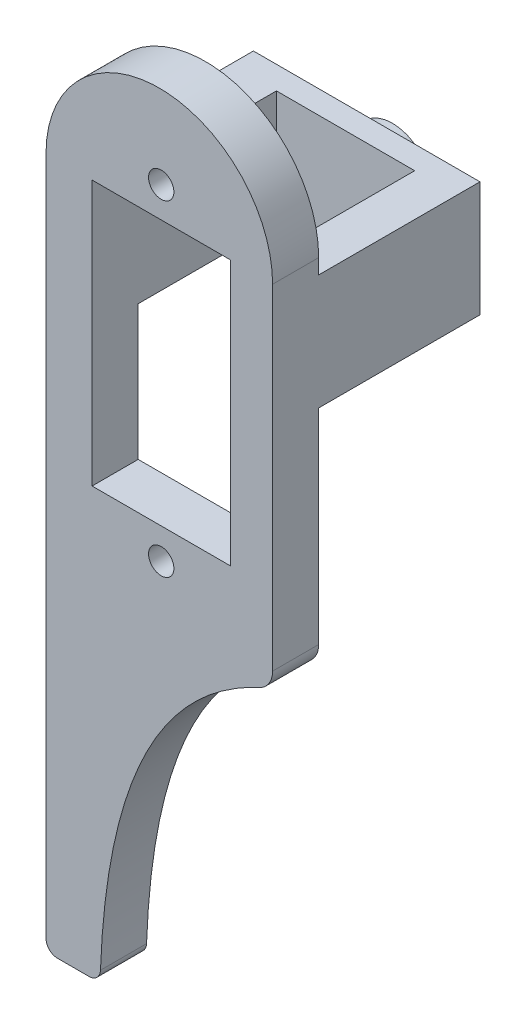
ISO-10303-21;
HEADER;
FILE_DESCRIPTION(('STEP AP214'),'2;1');
FILE_NAME('part.step','',(''),(''),'','','');
FILE_SCHEMA(('AUTOMOTIVE_DESIGN { 1 0 10303 214 1 1 1 1 }'));
ENDSEC;
DATA;
#1=APPLICATION_CONTEXT('core data for automotive mechanical design processes');
#2=APPLICATION_PROTOCOL_DEFINITION('international standard','automotive_design',2000,#1);
#3=PRODUCT_CONTEXT('',#1,'mechanical');
#4=PRODUCT('Part','Part','',(#3));
#5=PRODUCT_RELATED_PRODUCT_CATEGORY('part','',(#4));
#6=PRODUCT_DEFINITION_FORMATION('','',#4);
#7=PRODUCT_DEFINITION_CONTEXT('part definition',#1,'design');
#8=PRODUCT_DEFINITION('design','',#6,#7);
#9=PRODUCT_DEFINITION_SHAPE('','',#8);
#10=(LENGTH_UNIT() NAMED_UNIT(*) SI_UNIT(.MILLI.,.METRE.));
#11=(NAMED_UNIT(*) PLANE_ANGLE_UNIT() SI_UNIT($,.RADIAN.));
#12=(NAMED_UNIT(*) SI_UNIT($,.STERADIAN.) SOLID_ANGLE_UNIT());
#13=UNCERTAINTY_MEASURE_WITH_UNIT(LENGTH_MEASURE(1.E-05),#10,'distance_accuracy_value','');
#14=(GEOMETRIC_REPRESENTATION_CONTEXT(3) GLOBAL_UNCERTAINTY_ASSIGNED_CONTEXT((#13)) GLOBAL_UNIT_ASSIGNED_CONTEXT((#10,
#11,#12)) REPRESENTATION_CONTEXT('',''));
#15=CARTESIAN_POINT('',(0.,0.,0.));
#16=DIRECTION('',(0.,0.,1.));
#17=DIRECTION('',(1.,0.,0.));
#18=AXIS2_PLACEMENT_3D('',#15,#16,#17);
#19=CARTESIAN_POINT('',(20.0527361312337,1.43470935286026,0.));
#20=DIRECTION('',(0.,0.,-1.));
#21=DIRECTION('',(-1.,0.,0.));
#22=AXIS2_PLACEMENT_3D('',#19,#20,#21);
#23=PLANE('',#22);
#24=CARTESIAN_POINT('',(20.2195760836481,-24.2152906471397,0.));
#25=DIRECTION('',(0.,0.,-1.));
#26=DIRECTION('',(-1.,0.,0.));
#27=AXIS2_PLACEMENT_3D('',#24,#25,#26);
#28=CIRCLE('',#27,1.1);
#29=CARTESIAN_POINT('',(19.1195760836481,-24.2152906471397,0.));
#30=VERTEX_POINT('',#29);
#31=EDGE_CURVE('E193',#30,#30,#28,.F.);
#32=ORIENTED_EDGE('',*,*,#31,.T.);
#33=EDGE_LOOP('',(#32));
#34=FACE_BOUND('',#33,.T.);
#35=DIRECTION('',(0.,-1.,0.));
#36=VECTOR('',#35,1.);
#37=CARTESIAN_POINT('',(10.2195760836481,1.43470935286026,0.));
#38=LINE('',#37,#36);
#39=CARTESIAN_POINT('',(10.2195760836481,-9.86529064713974,0.));
#40=VERTEX_POINT('',#39);
#41=CARTESIAN_POINT('',(10.2195760836481,-57.5652906471397,0.));
#42=VERTEX_POINT('',#41);
#43=EDGE_CURVE('E56',#40,#42,#38,.T.);
#44=ORIENTED_EDGE('',*,*,#43,.F.);
#45=DIRECTION('',(-1.,0.,0.));
#46=VECTOR('',#45,1.);
#47=CARTESIAN_POINT('',(14.2195760836481,-9.86529064713974,0.));
#48=LINE('',#47,#46);
#49=CARTESIAN_POINT('',(14.2195760836481,-9.86529064713974,0.));
#50=VERTEX_POINT('',#49);
#51=EDGE_CURVE('E224',#50,#40,#48,.T.);
#52=ORIENTED_EDGE('',*,*,#51,.F.);
#53=DIRECTION('',(0.,-1.,0.));
#54=VECTOR('',#53,1.);
#55=CARTESIAN_POINT('',(14.2195760836481,1.43470935286026,0.));
#56=LINE('',#55,#54);
#57=CARTESIAN_POINT('',(14.2195760836481,-21.5652906471397,0.));
#58=VERTEX_POINT('',#57);
#59=EDGE_CURVE('E295',#50,#58,#56,.T.);
#60=ORIENTED_EDGE('',*,*,#59,.T.);
#61=DIRECTION('',(1.,0.,0.));
#62=VECTOR('',#61,1.);
#63=CARTESIAN_POINT('',(14.2195760836481,-21.5652906471397,0.));
#64=LINE('',#63,#62);
#65=CARTESIAN_POINT('',(26.2195760836481,-21.5652906471397,0.));
#66=VERTEX_POINT('',#65);
#67=EDGE_CURVE('E318',#58,#66,#64,.T.);
#68=ORIENTED_EDGE('',*,*,#67,.T.);
#69=DIRECTION('',(0.,1.,0.));
#70=VECTOR('',#69,1.);
#71=CARTESIAN_POINT('',(26.2195760836481,1.43470935286026,0.));
#72=LINE('',#71,#70);
#73=CARTESIAN_POINT('',(26.2195760836481,-9.86529064713974,0.));
#74=VERTEX_POINT('',#73);
#75=EDGE_CURVE('E288',#66,#74,#72,.T.);
#76=ORIENTED_EDGE('',*,*,#75,.T.);
#77=DIRECTION('',(-1.,0.,0.));
#78=VECTOR('',#77,1.);
#79=CARTESIAN_POINT('',(29.8858961788194,-9.86529064713974,0.));
#80=LINE('',#79,#78);
#81=CARTESIAN_POINT('',(29.8858961788194,-9.86529064713974,0.));
#82=VERTEX_POINT('',#81);
#83=EDGE_CURVE('E251',#82,#74,#80,.T.);
#84=ORIENTED_EDGE('',*,*,#83,.F.);
#85=DIRECTION('',(0.,1.,0.));
#86=VECTOR('',#85,1.);
#87=CARTESIAN_POINT('',(29.8858961788194,-28.969975988386,0.));
#88=LINE('',#87,#86);
#89=CARTESIAN_POINT('',(29.8858961788194,-27.6467575510426,0.));
#90=VERTEX_POINT('',#89);
#91=EDGE_CURVE('E189',#90,#82,#88,.T.);
#92=ORIENTED_EDGE('',*,*,#91,.F.);
#93=CARTESIAN_POINT('',(27.8858961788193,-27.6467575510426,0.));
#94=DIRECTION('',(0.,0.,-1.));
#95=DIRECTION('',(-1.,0.,0.));
#96=AXIS2_PLACEMENT_3D('',#93,#94,#95);
#97=CIRCLE('',#96,2.);
#98=CARTESIAN_POINT('',(28.7223689960516,-29.4634339740832,0.));
#99=VERTEX_POINT('',#98);
#100=EDGE_CURVE('E657',#90,#99,#97,.T.);
#101=ORIENTED_EDGE('',*,*,#100,.T.);
#102=CARTESIAN_POINT('',(14.9212994340402,-58.3072050953959,0.));
#103=CARTESIAN_POINT('',(15.603913992348,-34.5286239738719,0.));
#104=CARTESIAN_POINT('',(29.8858961788194,-28.969975988386,0.));
#105=B_SPLINE_CURVE_WITH_KNOTS('',2,(#102,#103,#104),.UNSPECIFIED.,.F.,.F.,(3,3),(0.,1.),.UNSPECIFIED.);
#106=CARTESIAN_POINT('',(14.9446503491445,-57.6029191019327,0.));
#107=VERTEX_POINT('',#106);
#108=EDGE_CURVE('E627',#107,#99,#105,.T.);
#109=ORIENTED_EDGE('',*,*,#108,.F.);
#110=CARTESIAN_POINT('',(13.9453585502239,-57.5652906471397,0.));
#111=DIRECTION('',(0.,0.,-1.));
#112=DIRECTION('',(-1.,0.,0.));
#113=AXIS2_PLACEMENT_3D('',#110,#111,#112);
#114=CIRCLE('',#113,1.);
#115=CARTESIAN_POINT('',(13.9453585502239,-58.5652906471397,0.));
#116=VERTEX_POINT('',#115);
#117=EDGE_CURVE('E672',#107,#116,#114,.T.);
#118=ORIENTED_EDGE('',*,*,#117,.T.);
#119=DIRECTION('',(1.,0.,0.));
#120=VECTOR('',#119,1.);
#121=CARTESIAN_POINT('',(10.2195760836481,-58.5652906471397,0.));
#122=LINE('',#121,#120);
#123=CARTESIAN_POINT('',(11.2195760836481,-58.5652906471397,0.));
#124=VERTEX_POINT('',#123);
#125=EDGE_CURVE('E641',#124,#116,#122,.T.);
#126=ORIENTED_EDGE('',*,*,#125,.F.);
#127=CARTESIAN_POINT('',(11.2195760836481,-57.5652906471397,0.));
#128=DIRECTION('',(0.,0.,-1.));
#129=DIRECTION('',(-1.,0.,0.));
#130=AXIS2_PLACEMENT_3D('',#127,#128,#129);
#131=CIRCLE('',#130,1.);
#132=EDGE_CURVE('E687',#124,#42,#131,.T.);
#133=ORIENTED_EDGE('',*,*,#132,.T.);
#134=EDGE_LOOP('',(#44,#52,#60,#68,#76,#84,#92,#101,#109,#118,#126,#133));
#135=FACE_BOUND('',#134,.T.);
#136=ADVANCED_FACE('F39',(#34,#135),#23,.T.);
#137=CARTESIAN_POINT('',(20.2195760836481,4.08470935286026,0.));
#138=DIRECTION('',(0.,0.,-1.));
#139=DIRECTION('',(-1.,0.,0.));
#140=AXIS2_PLACEMENT_3D('',#137,#138,#139);
#141=CIRCLE('',#140,1.1);
#142=CARTESIAN_POINT('',(19.1195760836481,4.08470935286026,0.));
#143=VERTEX_POINT('',#142);
#144=EDGE_CURVE('E277',#143,#143,#141,.F.);
#145=ORIENTED_EDGE('',*,*,#144,.T.);
#146=EDGE_LOOP('',(#145));
#147=FACE_BOUND('',#146,.T.);
#148=CARTESIAN_POINT('',(14.2195760836481,1.43470935286026,0.));
#149=VERTEX_POINT('',#148);
#150=CARTESIAN_POINT('',(14.2195760836481,0.134709352860258,0.));
#151=VERTEX_POINT('',#150);
#152=EDGE_CURVE('E296',#149,#151,#56,.T.);
#153=ORIENTED_EDGE('',*,*,#152,.T.);
#154=DIRECTION('',(1.,0.,0.));
#155=VECTOR('',#154,1.);
#156=CARTESIAN_POINT('',(14.2195760836481,0.134709352860258,0.));
#157=LINE('',#156,#155);
#158=CARTESIAN_POINT('',(10.2195760836481,0.134709352860258,0.));
#159=VERTEX_POINT('',#158);
#160=EDGE_CURVE('E64',#159,#151,#157,.T.);
#161=ORIENTED_EDGE('',*,*,#160,.F.);
#162=CARTESIAN_POINT('',(10.2195760836481,1.43470935286026,0.));
#163=VERTEX_POINT('',#162);
#164=EDGE_CURVE('E634',#163,#159,#38,.T.);
#165=ORIENTED_EDGE('',*,*,#164,.F.);
#166=CARTESIAN_POINT('',(20.0527361312337,1.43470935286026,0.));
#167=DIRECTION('',(0.,0.,1.));
#168=DIRECTION('',(-1.,0.,0.));
#169=AXIS2_PLACEMENT_3D('',#166,#167,#168);
#170=CIRCLE('',#169,9.83316004758562);
#171=CARTESIAN_POINT('',(29.8858961788194,1.43470935286026,0.));
#172=VERTEX_POINT('',#171);
#173=EDGE_CURVE('E331',#172,#163,#170,.T.);
#174=ORIENTED_EDGE('',*,*,#173,.F.);
#175=CARTESIAN_POINT('',(29.8858961788194,0.134709352860259,0.));
#176=VERTEX_POINT('',#175);
#177=EDGE_CURVE('E621',#176,#172,#88,.T.);
#178=ORIENTED_EDGE('',*,*,#177,.F.);
#179=DIRECTION('',(1.,0.,0.));
#180=VECTOR('',#179,1.);
#181=CARTESIAN_POINT('',(29.8858961788194,0.134709352860259,0.));
#182=LINE('',#181,#180);
#183=CARTESIAN_POINT('',(26.2195760836481,0.134709352860258,0.));
#184=VERTEX_POINT('',#183);
#185=EDGE_CURVE('E257',#184,#176,#182,.T.);
#186=ORIENTED_EDGE('',*,*,#185,.F.);
#187=CARTESIAN_POINT('',(26.2195760836481,1.43470935286026,0.));
#188=VERTEX_POINT('',#187);
#189=EDGE_CURVE('E276',#184,#188,#72,.T.);
#190=ORIENTED_EDGE('',*,*,#189,.T.);
#191=DIRECTION('',(-1.,0.,0.));
#192=VECTOR('',#191,1.);
#193=CARTESIAN_POINT('',(14.2195760836481,1.43470935286026,0.));
#194=LINE('',#193,#192);
#195=EDGE_CURVE('E291',#188,#149,#194,.T.);
#196=ORIENTED_EDGE('',*,*,#195,.T.);
#197=EDGE_LOOP('',(#153,#161,#165,#174,#178,#186,#190,#196));
#198=FACE_BOUND('',#197,.T.);
#199=ADVANCED_FACE('F372',(#147,#198),#23,.T.);
#200=CARTESIAN_POINT('',(20.0527361312337,1.43470935286026,4.));
#201=DIRECTION('',(0.,0.,-1.));
#202=DIRECTION('',(-1.,0.,0.));
#203=AXIS2_PLACEMENT_3D('',#200,#201,#202);
#204=CYLINDRICAL_SURFACE('',#203,9.83316004758562);
#205=ORIENTED_EDGE('',*,*,#173,.T.);
#206=DIRECTION('',(0.,0.,-1.));
#207=VECTOR('',#206,1.);
#208=CARTESIAN_POINT('',(10.2195760836481,1.43470935286026,4.));
#209=LINE('',#208,#207);
#210=CARTESIAN_POINT('',(10.2195760836481,1.43470935286026,4.));
#211=VERTEX_POINT('',#210);
#212=EDGE_CURVE('E632',#211,#163,#209,.T.);
#213=ORIENTED_EDGE('',*,*,#212,.F.);
#214=CARTESIAN_POINT('',(20.0527361312337,1.43470935286026,4.));
#215=DIRECTION('',(0.,0.,1.));
#216=DIRECTION('',(-1.,0.,0.));
#217=AXIS2_PLACEMENT_3D('',#214,#215,#216);
#218=CIRCLE('',#217,9.83316004758562);
#219=CARTESIAN_POINT('',(29.8858961788194,1.43470935286026,4.));
#220=VERTEX_POINT('',#219);
#221=EDGE_CURVE('E332',#220,#211,#218,.T.);
#222=ORIENTED_EDGE('',*,*,#221,.F.);
#223=DIRECTION('',(0.,0.,-1.));
#224=VECTOR('',#223,1.);
#225=CARTESIAN_POINT('',(29.8858961788194,1.43470935286026,4.));
#226=LINE('',#225,#224);
#227=EDGE_CURVE('E623',#220,#172,#226,.T.);
#228=ORIENTED_EDGE('',*,*,#227,.T.);
#229=EDGE_LOOP('',(#205,#213,#222,#228));
#230=FACE_BOUND('',#229,.T.);
#231=ADVANCED_FACE('F368',(#230),#204,.T.);
#232=CARTESIAN_POINT('',(10.2195760836481,1.43470935286026,4.));
#233=DIRECTION('',(1.,0.,0.));
#234=DIRECTION('',(0.,0.,-1.));
#235=AXIS2_PLACEMENT_3D('',#232,#233,#234);
#236=PLANE('',#235);
#237=ORIENTED_EDGE('',*,*,#164,.T.);
#238=DIRECTION('',(0.,0.,1.));
#239=VECTOR('',#238,1.);
#240=CARTESIAN_POINT('',(10.2195760836481,0.134709352860258,-12.));
#241=LINE('',#240,#239);
#242=CARTESIAN_POINT('',(10.2195760836481,0.134709352860259,-14.));
#243=VERTEX_POINT('',#242);
#244=EDGE_CURVE('E241',#243,#159,#241,.T.);
#245=ORIENTED_EDGE('',*,*,#244,.F.);
#246=DIRECTION('',(0.,1.,0.));
#247=VECTOR('',#246,1.);
#248=CARTESIAN_POINT('',(10.2195760836481,0.134709352860259,-14.));
#249=LINE('',#248,#247);
#250=CARTESIAN_POINT('',(10.2195760836481,-9.86529064713974,-14.));
#251=VERTEX_POINT('',#250);
#252=EDGE_CURVE('E205',#251,#243,#249,.T.);
#253=ORIENTED_EDGE('',*,*,#252,.F.);
#254=DIRECTION('',(0.,0.,1.));
#255=VECTOR('',#254,1.);
#256=CARTESIAN_POINT('',(10.2195760836481,-9.86529064713974,-12.));
#257=LINE('',#256,#255);
#258=EDGE_CURVE('E200',#251,#40,#257,.T.);
#259=ORIENTED_EDGE('',*,*,#258,.T.);
#260=ORIENTED_EDGE('',*,*,#43,.T.);
#261=DIRECTION('',(0.,0.,-1.));
#262=VECTOR('',#261,1.);
#263=CARTESIAN_POINT('',(10.2195760836481,-57.5652906471397,4.));
#264=LINE('',#263,#262);
#265=CARTESIAN_POINT('',(10.2195760836481,-57.5652906471397,4.));
#266=VERTEX_POINT('',#265);
#267=EDGE_CURVE('E689',#42,#266,#264,.F.);
#268=ORIENTED_EDGE('',*,*,#267,.T.);
#269=DIRECTION('',(0.,-1.,0.));
#270=VECTOR('',#269,1.);
#271=CARTESIAN_POINT('',(10.2195760836481,1.43470935286026,4.));
#272=LINE('',#271,#270);
#273=EDGE_CURVE('E336',#211,#266,#272,.T.);
#274=ORIENTED_EDGE('',*,*,#273,.F.);
#275=ORIENTED_EDGE('',*,*,#212,.T.);
#276=EDGE_LOOP('',(#237,#245,#253,#259,#260,#268,#274,#275));
#277=FACE_BOUND('',#276,.T.);
#278=ADVANCED_FACE('F364',(#277),#236,.F.);
#279=CARTESIAN_POINT('',(10.2195760836481,-58.5652906471397,4.));
#280=DIRECTION('',(0.,1.,0.));
#281=DIRECTION('',(0.,0.,1.));
#282=AXIS2_PLACEMENT_3D('',#279,#280,#281);
#283=PLANE('',#282);
#284=DIRECTION('',(1.,0.,0.));
#285=VECTOR('',#284,1.);
#286=CARTESIAN_POINT('',(10.2195760836481,-58.5652906471397,4.));
#287=LINE('',#286,#285);
#288=CARTESIAN_POINT('',(11.2195760836481,-58.5652906471397,4.));
#289=VERTEX_POINT('',#288);
#290=CARTESIAN_POINT('',(13.9453585502239,-58.5652906471397,4.));
#291=VERTEX_POINT('',#290);
#292=EDGE_CURVE('E340',#289,#291,#287,.T.);
#293=ORIENTED_EDGE('',*,*,#292,.F.);
#294=DIRECTION('',(0.,0.,-1.));
#295=VECTOR('',#294,1.);
#296=CARTESIAN_POINT('',(11.2195760836481,-58.5652906471397,4.));
#297=LINE('',#296,#295);
#298=EDGE_CURVE('E683',#289,#124,#297,.T.);
#299=ORIENTED_EDGE('',*,*,#298,.T.);
#300=ORIENTED_EDGE('',*,*,#125,.T.);
#301=DIRECTION('',(0.,0.,-1.));
#302=VECTOR('',#301,1.);
#303=CARTESIAN_POINT('',(13.9453585502239,-58.5652906471397,4.));
#304=LINE('',#303,#302);
#305=EDGE_CURVE('E676',#116,#291,#304,.F.);
#306=ORIENTED_EDGE('',*,*,#305,.T.);
#307=EDGE_LOOP('',(#293,#299,#300,#306));
#308=FACE_BOUND('',#307,.T.);
#309=ADVANCED_FACE('F359',(#308),#283,.F.);
#310=CARTESIAN_POINT('',(14.9212994340402,-58.3072050953959,4.));
#311=CARTESIAN_POINT('',(15.603913992348,-34.5286239738719,4.));
#312=CARTESIAN_POINT('',(29.8858961788194,-28.969975988386,4.));
#313=B_SPLINE_CURVE_WITH_KNOTS('',2,(#310,#311,#312),.UNSPECIFIED.,.F.,.F.,(3,3),(0.,1.),.UNSPECIFIED.);
#314=DIRECTION('',(0.,0.,-1.));
#315=VECTOR('',#314,1.);
#316=SURFACE_OF_LINEAR_EXTRUSION('',#313,#315);
#317=CARTESIAN_POINT('',(14.9446503491445,-57.6029191019327,4.));
#318=VERTEX_POINT('',#317);
#319=CARTESIAN_POINT('',(28.7223689960516,-29.4634339740832,4.));
#320=VERTEX_POINT('',#319);
#321=EDGE_CURVE('E343',#318,#320,#313,.T.);
#322=ORIENTED_EDGE('',*,*,#321,.F.);
#323=DIRECTION('',(0.,0.,-1.));
#324=VECTOR('',#323,1.);
#325=CARTESIAN_POINT('',(14.9446503491445,-57.6029191019324,4.));
#326=LINE('',#325,#324);
#327=EDGE_CURVE('E668',#318,#107,#326,.T.);
#328=ORIENTED_EDGE('',*,*,#327,.T.);
#329=ORIENTED_EDGE('',*,*,#108,.T.);
#330=DIRECTION('',(0.,0.,-1.));
#331=VECTOR('',#330,1.);
#332=CARTESIAN_POINT('',(28.7223689960495,-29.4634339740842,0.));
#333=LINE('',#332,#331);
#334=EDGE_CURVE('E661',#99,#320,#333,.F.);
#335=ORIENTED_EDGE('',*,*,#334,.T.);
#336=EDGE_LOOP('',(#322,#328,#329,#335));
#337=FACE_BOUND('',#336,.T.);
#338=ADVANCED_FACE('F355',(#337),#316,.F.);
#339=CARTESIAN_POINT('',(29.8858961788194,-28.969975988386,4.));
#340=DIRECTION('',(-1.,0.,0.));
#341=DIRECTION('',(0.,0.,1.));
#342=AXIS2_PLACEMENT_3D('',#339,#340,#341);
#343=PLANE('',#342);
#344=DIRECTION('',(0.,1.,0.));
#345=VECTOR('',#344,1.);
#346=CARTESIAN_POINT('',(29.8858961788194,-28.969975988386,4.));
#347=LINE('',#346,#345);
#348=CARTESIAN_POINT('',(29.8858961788194,-27.6467575510426,4.));
#349=VERTEX_POINT('',#348);
#350=EDGE_CURVE('E349',#349,#220,#347,.T.);
#351=ORIENTED_EDGE('',*,*,#350,.F.);
#352=DIRECTION('',(0.,0.,-1.));
#353=VECTOR('',#352,1.);
#354=CARTESIAN_POINT('',(29.8858961788194,-27.6467575510426,4.));
#355=LINE('',#354,#353);
#356=EDGE_CURVE('E654',#349,#90,#355,.T.);
#357=ORIENTED_EDGE('',*,*,#356,.T.);
#358=ORIENTED_EDGE('',*,*,#91,.T.);
#359=DIRECTION('',(0.,0.,1.));
#360=VECTOR('',#359,1.);
#361=CARTESIAN_POINT('',(29.8858961788194,-9.86529064713974,-12.));
#362=LINE('',#361,#360);
#363=CARTESIAN_POINT('',(29.8858961788194,-9.86529064713974,-14.));
#364=VERTEX_POINT('',#363);
#365=EDGE_CURVE('E180',#364,#82,#362,.T.);
#366=ORIENTED_EDGE('',*,*,#365,.F.);
#367=DIRECTION('',(0.,-1.,0.));
#368=VECTOR('',#367,1.);
#369=CARTESIAN_POINT('',(29.8858961788194,0.134709352860259,-14.));
#370=LINE('',#369,#368);
#371=CARTESIAN_POINT('',(29.8858961788194,0.134709352860259,-14.));
#372=VERTEX_POINT('',#371);
#373=EDGE_CURVE('E186',#372,#364,#370,.T.);
#374=ORIENTED_EDGE('',*,*,#373,.F.);
#375=DIRECTION('',(0.,0.,1.));
#376=VECTOR('',#375,1.);
#377=CARTESIAN_POINT('',(29.8858961788194,0.134709352860259,-12.));
#378=LINE('',#377,#376);
#379=EDGE_CURVE('E256',#372,#176,#378,.T.);
#380=ORIENTED_EDGE('',*,*,#379,.T.);
#381=ORIENTED_EDGE('',*,*,#177,.T.);
#382=ORIENTED_EDGE('',*,*,#227,.F.);
#383=EDGE_LOOP('',(#351,#357,#358,#366,#374,#380,#381,#382));
#384=FACE_BOUND('',#383,.T.);
#385=ADVANCED_FACE('F183',(#384),#343,.F.);
#386=CARTESIAN_POINT('',(20.0527361312337,1.43470935286026,4.));
#387=DIRECTION('',(0.,0.,-1.));
#388=DIRECTION('',(-1.,0.,0.));
#389=AXIS2_PLACEMENT_3D('',#386,#387,#388);
#390=PLANE('',#389);
#391=CARTESIAN_POINT('',(20.2195760836481,-24.2152906471397,4.));
#392=DIRECTION('',(0.,0.,1.));
#393=DIRECTION('',(1.,0.,0.));
#394=AXIS2_PLACEMENT_3D('',#391,#392,#393);
#395=CIRCLE('',#394,1.1);
#396=CARTESIAN_POINT('',(21.3195760836481,-24.2152906471397,4.));
#397=VERTEX_POINT('',#396);
#398=EDGE_CURVE('E281',#397,#397,#395,.T.);
#399=ORIENTED_EDGE('',*,*,#398,.F.);
#400=EDGE_LOOP('',(#399));
#401=FACE_BOUND('',#400,.T.);
#402=CARTESIAN_POINT('',(20.2195760836481,4.08470935286026,4.));
#403=DIRECTION('',(0.,0.,1.));
#404=DIRECTION('',(1.,0.,0.));
#405=AXIS2_PLACEMENT_3D('',#402,#403,#404);
#406=CIRCLE('',#405,1.1);
#407=CARTESIAN_POINT('',(21.3195760836481,4.08470935286026,4.));
#408=VERTEX_POINT('',#407);
#409=EDGE_CURVE('E272',#408,#408,#406,.T.);
#410=ORIENTED_EDGE('',*,*,#409,.F.);
#411=EDGE_LOOP('',(#410));
#412=FACE_BOUND('',#411,.T.);
#413=DIRECTION('',(1.,0.,0.));
#414=VECTOR('',#413,1.);
#415=CARTESIAN_POINT('',(14.2195760836481,-21.5652906471397,4.));
#416=LINE('',#415,#414);
#417=CARTESIAN_POINT('',(14.2195760836481,-21.5652906471397,4.));
#418=VERTEX_POINT('',#417);
#419=CARTESIAN_POINT('',(26.2195760836481,-21.5652906471397,4.));
#420=VERTEX_POINT('',#419);
#421=EDGE_CURVE('E302',#418,#420,#416,.T.);
#422=ORIENTED_EDGE('',*,*,#421,.F.);
#423=DIRECTION('',(0.,-1.,0.));
#424=VECTOR('',#423,1.);
#425=CARTESIAN_POINT('',(14.2195760836481,1.43470935286026,4.));
#426=LINE('',#425,#424);
#427=CARTESIAN_POINT('',(14.2195760836481,1.43470935286026,4.));
#428=VERTEX_POINT('',#427);
#429=EDGE_CURVE('E299',#428,#418,#426,.T.);
#430=ORIENTED_EDGE('',*,*,#429,.F.);
#431=DIRECTION('',(-1.,0.,0.));
#432=VECTOR('',#431,1.);
#433=CARTESIAN_POINT('',(14.2195760836481,1.43470935286026,4.));
#434=LINE('',#433,#432);
#435=CARTESIAN_POINT('',(26.2195760836481,1.43470935286026,4.));
#436=VERTEX_POINT('',#435);
#437=EDGE_CURVE('E310',#436,#428,#434,.T.);
#438=ORIENTED_EDGE('',*,*,#437,.F.);
#439=DIRECTION('',(0.,1.,0.));
#440=VECTOR('',#439,1.);
#441=CARTESIAN_POINT('',(26.2195760836481,1.43470935286026,4.));
#442=LINE('',#441,#440);
#443=EDGE_CURVE('E306',#420,#436,#442,.T.);
#444=ORIENTED_EDGE('',*,*,#443,.F.);
#445=EDGE_LOOP('',(#422,#430,#438,#444));
#446=FACE_BOUND('',#445,.T.);
#447=ORIENTED_EDGE('',*,*,#273,.T.);
#448=CARTESIAN_POINT('',(11.2195760836481,-57.5652906471397,4.));
#449=DIRECTION('',(0.,0.,-1.));
#450=DIRECTION('',(-1.,0.,0.));
#451=AXIS2_PLACEMENT_3D('',#448,#449,#450);
#452=CIRCLE('',#451,1.);
#453=EDGE_CURVE('E43',#266,#289,#452,.F.);
#454=ORIENTED_EDGE('',*,*,#453,.T.);
#455=ORIENTED_EDGE('',*,*,#292,.T.);
#456=CARTESIAN_POINT('',(13.9453585502239,-57.5652906471397,4.));
#457=DIRECTION('',(0.,0.,-1.));
#458=DIRECTION('',(-1.,0.,0.));
#459=AXIS2_PLACEMENT_3D('',#456,#457,#458);
#460=CIRCLE('',#459,1.);
#461=EDGE_CURVE('E680',#291,#318,#460,.F.);
#462=ORIENTED_EDGE('',*,*,#461,.T.);
#463=ORIENTED_EDGE('',*,*,#321,.T.);
#464=CARTESIAN_POINT('',(27.8858961788193,-27.6467575510426,4.));
#465=DIRECTION('',(0.,0.,-1.));
#466=DIRECTION('',(-1.,0.,0.));
#467=AXIS2_PLACEMENT_3D('',#464,#465,#466);
#468=CIRCLE('',#467,2.);
#469=EDGE_CURVE('E665',#320,#349,#468,.F.);
#470=ORIENTED_EDGE('',*,*,#469,.T.);
#471=ORIENTED_EDGE('',*,*,#350,.T.);
#472=ORIENTED_EDGE('',*,*,#221,.T.);
#473=EDGE_LOOP('',(#447,#454,#455,#462,#463,#470,#471,#472));
#474=FACE_BOUND('',#473,.T.);
#475=ADVANCED_FACE('F393',(#401,#412,#446,#474),#390,.F.);
#476=CARTESIAN_POINT('',(14.2195760836481,1.43470935286026,-0.00100000000000013));
#477=DIRECTION('',(-1.,0.,0.));
#478=DIRECTION('',(0.,-1.,0.));
#479=AXIS2_PLACEMENT_3D('',#476,#477,#478);
#480=PLANE('',#479);
#481=DIRECTION('',(0.,0.,1.));
#482=VECTOR('',#481,1.);
#483=CARTESIAN_POINT('',(14.2195760836481,1.43470935286026,-0.00100000000000013));
#484=LINE('',#483,#482);
#485=EDGE_CURVE('E315',#149,#428,#484,.T.);
#486=ORIENTED_EDGE('',*,*,#485,.T.);
#487=ORIENTED_EDGE('',*,*,#429,.T.);
#488=DIRECTION('',(0.,0.,1.));
#489=VECTOR('',#488,1.);
#490=CARTESIAN_POINT('',(14.2195760836481,-21.5652906471397,-0.00100000000000013));
#491=LINE('',#490,#489);
#492=EDGE_CURVE('E314',#58,#418,#491,.T.);
#493=ORIENTED_EDGE('',*,*,#492,.F.);
#494=ORIENTED_EDGE('',*,*,#59,.F.);
#495=DIRECTION('',(0.,0.,1.));
#496=VECTOR('',#495,1.);
#497=CARTESIAN_POINT('',(14.2195760836481,-9.86529064713974,-12.));
#498=LINE('',#497,#496);
#499=CARTESIAN_POINT('',(14.2195760836481,-9.86529064713974,-12.));
#500=VERTEX_POINT('',#499);
#501=EDGE_CURVE('E247',#500,#50,#498,.T.);
#502=ORIENTED_EDGE('',*,*,#501,.F.);
#503=DIRECTION('',(0.,-1.,0.));
#504=VECTOR('',#503,1.);
#505=CARTESIAN_POINT('',(14.2195760836481,0.134709352860258,-12.));
#506=LINE('',#505,#504);
#507=CARTESIAN_POINT('',(14.2195760836481,0.134709352860258,-12.));
#508=VERTEX_POINT('',#507);
#509=EDGE_CURVE('E229',#508,#500,#506,.T.);
#510=ORIENTED_EDGE('',*,*,#509,.F.);
#511=DIRECTION('',(0.,0.,1.));
#512=VECTOR('',#511,1.);
#513=CARTESIAN_POINT('',(14.2195760836481,0.134709352860258,-12.));
#514=LINE('',#513,#512);
#515=EDGE_CURVE('E233',#508,#151,#514,.T.);
#516=ORIENTED_EDGE('',*,*,#515,.T.);
#517=ORIENTED_EDGE('',*,*,#152,.F.);
#518=EDGE_LOOP('',(#486,#487,#493,#494,#502,#510,#516,#517));
#519=FACE_BOUND('',#518,.T.);
#520=ADVANCED_FACE('F396',(#519),#480,.F.);
#521=CARTESIAN_POINT('',(14.2195760836481,1.43470935286026,-0.00100000000000013));
#522=DIRECTION('',(0.,1.,0.));
#523=DIRECTION('',(-1.,0.,0.));
#524=AXIS2_PLACEMENT_3D('',#521,#522,#523);
#525=PLANE('',#524);
#526=DIRECTION('',(0.,0.,1.));
#527=VECTOR('',#526,1.);
#528=CARTESIAN_POINT('',(26.2195760836481,1.43470935286026,-0.00100000000000013));
#529=LINE('',#528,#527);
#530=EDGE_CURVE('E319',#188,#436,#529,.T.);
#531=ORIENTED_EDGE('',*,*,#530,.T.);
#532=ORIENTED_EDGE('',*,*,#437,.T.);
#533=ORIENTED_EDGE('',*,*,#485,.F.);
#534=ORIENTED_EDGE('',*,*,#195,.F.);
#535=EDGE_LOOP('',(#531,#532,#533,#534));
#536=FACE_BOUND('',#535,.T.);
#537=ADVANCED_FACE('F400',(#536),#525,.F.);
#538=CARTESIAN_POINT('',(26.2195760836481,1.43470935286026,-0.00100000000000013));
#539=DIRECTION('',(1.,0.,0.));
#540=DIRECTION('',(0.,1.,0.));
#541=AXIS2_PLACEMENT_3D('',#538,#539,#540);
#542=PLANE('',#541);
#543=DIRECTION('',(0.,0.,1.));
#544=VECTOR('',#543,1.);
#545=CARTESIAN_POINT('',(26.2195760836481,-21.5652906471397,-0.00100000000000013));
#546=LINE('',#545,#544);
#547=EDGE_CURVE('E322',#66,#420,#546,.T.);
#548=ORIENTED_EDGE('',*,*,#547,.T.);
#549=ORIENTED_EDGE('',*,*,#443,.T.);
#550=ORIENTED_EDGE('',*,*,#530,.F.);
#551=ORIENTED_EDGE('',*,*,#189,.F.);
#552=DIRECTION('',(0.,0.,1.));
#553=VECTOR('',#552,1.);
#554=CARTESIAN_POINT('',(26.2195760836481,0.134709352860258,-12.));
#555=LINE('',#554,#553);
#556=CARTESIAN_POINT('',(26.2195760836481,0.134709352860259,-12.));
#557=VERTEX_POINT('',#556);
#558=EDGE_CURVE('E265',#557,#184,#555,.T.);
#559=ORIENTED_EDGE('',*,*,#558,.F.);
#560=DIRECTION('',(0.,1.,0.));
#561=VECTOR('',#560,1.);
#562=CARTESIAN_POINT('',(26.2195760836481,0.134709352860258,-12.));
#563=LINE('',#562,#561);
#564=CARTESIAN_POINT('',(26.2195760836481,-9.86529064713974,-12.));
#565=VERTEX_POINT('',#564);
#566=EDGE_CURVE('E252',#565,#557,#563,.T.);
#567=ORIENTED_EDGE('',*,*,#566,.F.);
#568=DIRECTION('',(0.,0.,1.));
#569=VECTOR('',#568,1.);
#570=CARTESIAN_POINT('',(26.2195760836481,-9.86529064713974,-12.));
#571=LINE('',#570,#569);
#572=EDGE_CURVE('E194',#565,#74,#571,.T.);
#573=ORIENTED_EDGE('',*,*,#572,.T.);
#574=ORIENTED_EDGE('',*,*,#75,.F.);
#575=EDGE_LOOP('',(#548,#549,#550,#551,#559,#567,#573,#574));
#576=FACE_BOUND('',#575,.T.);
#577=ADVANCED_FACE('F406',(#576),#542,.F.);
#578=CARTESIAN_POINT('',(14.2195760836481,-21.5652906471397,-0.00100000000000013));
#579=DIRECTION('',(0.,-1.,0.));
#580=DIRECTION('',(0.,0.,-1.));
#581=AXIS2_PLACEMENT_3D('',#578,#579,#580);
#582=PLANE('',#581);
#583=ORIENTED_EDGE('',*,*,#492,.T.);
#584=ORIENTED_EDGE('',*,*,#421,.T.);
#585=ORIENTED_EDGE('',*,*,#547,.F.);
#586=ORIENTED_EDGE('',*,*,#67,.F.);
#587=EDGE_LOOP('',(#583,#584,#585,#586));
#588=FACE_BOUND('',#587,.T.);
#589=ADVANCED_FACE('F402',(#588),#582,.F.);
#590=CARTESIAN_POINT('',(20.2195760836481,4.08470935286026,-0.00100000000000013));
#591=DIRECTION('',(0.,0.,1.));
#592=DIRECTION('',(1.,0.,0.));
#593=AXIS2_PLACEMENT_3D('',#590,#591,#592);
#594=CYLINDRICAL_SURFACE('',#593,1.1);
#595=ORIENTED_EDGE('',*,*,#144,.F.);
#596=EDGE_LOOP('',(#595));
#597=FACE_BOUND('',#596,.T.);
#598=ORIENTED_EDGE('',*,*,#409,.T.);
#599=EDGE_LOOP('',(#598));
#600=FACE_BOUND('',#599,.T.);
#601=ADVANCED_FACE('F405',(#597,#600),#594,.F.);
#602=CARTESIAN_POINT('',(20.2195760836481,-24.2152906471397,-0.00100000000000013));
#603=DIRECTION('',(0.,0.,1.));
#604=DIRECTION('',(1.,0.,0.));
#605=AXIS2_PLACEMENT_3D('',#602,#603,#604);
#606=CYLINDRICAL_SURFACE('',#605,1.1);
#607=ORIENTED_EDGE('',*,*,#31,.F.);
#608=EDGE_LOOP('',(#607));
#609=FACE_BOUND('',#608,.T.);
#610=ORIENTED_EDGE('',*,*,#398,.T.);
#611=EDGE_LOOP('',(#610));
#612=FACE_BOUND('',#611,.T.);
#613=ADVANCED_FACE('F377',(#609,#612),#606,.F.);
#614=CARTESIAN_POINT('',(27.8858961788193,-27.6467575510426,2.));
#615=DIRECTION('',(0.,0.,-1.));
#616=DIRECTION('',(-1.,0.,0.));
#617=AXIS2_PLACEMENT_3D('',#614,#615,#616);
#618=CYLINDRICAL_SURFACE('',#617,2.);
#619=ORIENTED_EDGE('',*,*,#469,.F.);
#620=ORIENTED_EDGE('',*,*,#334,.F.);
#621=ORIENTED_EDGE('',*,*,#100,.F.);
#622=ORIENTED_EDGE('',*,*,#356,.F.);
#623=EDGE_LOOP('',(#619,#620,#621,#622));
#624=FACE_BOUND('',#623,.T.);
#625=ADVANCED_FACE('F374',(#624),#618,.T.);
#626=CARTESIAN_POINT('',(13.9453585502239,-57.5652906471397,2.));
#627=DIRECTION('',(0.,0.,-1.));
#628=DIRECTION('',(-1.,0.,0.));
#629=AXIS2_PLACEMENT_3D('',#626,#627,#628);
#630=CYLINDRICAL_SURFACE('',#629,1.);
#631=ORIENTED_EDGE('',*,*,#461,.F.);
#632=ORIENTED_EDGE('',*,*,#305,.F.);
#633=ORIENTED_EDGE('',*,*,#117,.F.);
#634=ORIENTED_EDGE('',*,*,#327,.F.);
#635=EDGE_LOOP('',(#631,#632,#633,#634));
#636=FACE_BOUND('',#635,.T.);
#637=ADVANCED_FACE('F376',(#636),#630,.T.);
#638=CARTESIAN_POINT('',(11.2195760836481,-57.5652906471397,4.));
#639=DIRECTION('',(0.,0.,-1.));
#640=DIRECTION('',(-1.,0.,0.));
#641=AXIS2_PLACEMENT_3D('',#638,#639,#640);
#642=CYLINDRICAL_SURFACE('',#641,1.);
#643=ORIENTED_EDGE('',*,*,#453,.F.);
#644=ORIENTED_EDGE('',*,*,#267,.F.);
#645=ORIENTED_EDGE('',*,*,#132,.F.);
#646=ORIENTED_EDGE('',*,*,#298,.F.);
#647=EDGE_LOOP('',(#643,#644,#645,#646));
#648=FACE_BOUND('',#647,.T.);
#649=ADVANCED_FACE('F41',(#648),#642,.T.);
#650=CARTESIAN_POINT('',(29.8858961788194,-9.86529064713974,-12.));
#651=DIRECTION('',(0.,1.,0.));
#652=DIRECTION('',(0.,0.,1.));
#653=AXIS2_PLACEMENT_3D('',#650,#651,#652);
#654=PLANE('',#653);
#655=ORIENTED_EDGE('',*,*,#83,.T.);
#656=ORIENTED_EDGE('',*,*,#572,.F.);
#657=DIRECTION('',(-1.,0.,0.));
#658=VECTOR('',#657,1.);
#659=CARTESIAN_POINT('',(29.8858961788194,-9.86529064713974,-12.));
#660=LINE('',#659,#658);
#661=EDGE_CURVE('E216',#565,#500,#660,.T.);
#662=ORIENTED_EDGE('',*,*,#661,.T.);
#663=ORIENTED_EDGE('',*,*,#501,.T.);
#664=ORIENTED_EDGE('',*,*,#51,.T.);
#665=ORIENTED_EDGE('',*,*,#258,.F.);
#666=DIRECTION('',(-1.,0.,0.));
#667=VECTOR('',#666,1.);
#668=CARTESIAN_POINT('',(29.8858961788194,-9.86529064713974,-14.));
#669=LINE('',#668,#667);
#670=EDGE_CURVE('E197',#364,#251,#669,.T.);
#671=ORIENTED_EDGE('',*,*,#670,.F.);
#672=ORIENTED_EDGE('',*,*,#365,.T.);
#673=EDGE_LOOP('',(#655,#656,#662,#663,#664,#665,#671,#672));
#674=FACE_BOUND('',#673,.T.);
#675=ADVANCED_FACE('F198',(#674),#654,.F.);
#676=CARTESIAN_POINT('',(29.8858961788194,0.134709352860259,-12.));
#677=DIRECTION('',(0.,-1.,0.));
#678=DIRECTION('',(1.,0.,0.));
#679=AXIS2_PLACEMENT_3D('',#676,#677,#678);
#680=PLANE('',#679);
#681=ORIENTED_EDGE('',*,*,#185,.T.);
#682=ORIENTED_EDGE('',*,*,#379,.F.);
#683=DIRECTION('',(1.,0.,0.));
#684=VECTOR('',#683,1.);
#685=CARTESIAN_POINT('',(29.8858961788194,0.134709352860259,-14.));
#686=LINE('',#685,#684);
#687=EDGE_CURVE('E210',#243,#372,#686,.T.);
#688=ORIENTED_EDGE('',*,*,#687,.F.);
#689=ORIENTED_EDGE('',*,*,#244,.T.);
#690=ORIENTED_EDGE('',*,*,#160,.T.);
#691=ORIENTED_EDGE('',*,*,#515,.F.);
#692=DIRECTION('',(1.,0.,0.));
#693=VECTOR('',#692,1.);
#694=CARTESIAN_POINT('',(29.8858961788194,0.134709352860259,-12.));
#695=LINE('',#694,#693);
#696=EDGE_CURVE('E212',#508,#557,#695,.T.);
#697=ORIENTED_EDGE('',*,*,#696,.T.);
#698=ORIENTED_EDGE('',*,*,#558,.T.);
#699=EDGE_LOOP('',(#681,#682,#688,#689,#690,#691,#697,#698));
#700=FACE_BOUND('',#699,.T.);
#701=ADVANCED_FACE('F422',(#700),#680,.F.);
#702=CARTESIAN_POINT('',(0.,0.,-12.));
#703=DIRECTION('',(0.,0.,-1.));
#704=DIRECTION('',(-1.,0.,0.));
#705=AXIS2_PLACEMENT_3D('',#702,#703,#704);
#706=PLANE('',#705);
#707=ORIENTED_EDGE('',*,*,#661,.F.);
#708=ORIENTED_EDGE('',*,*,#566,.T.);
#709=ORIENTED_EDGE('',*,*,#696,.F.);
#710=ORIENTED_EDGE('',*,*,#509,.T.);
#711=EDGE_LOOP('',(#707,#708,#709,#710));
#712=FACE_BOUND('',#711,.T.);
#713=ADVANCED_FACE('F425',(#712),#706,.F.);
#714=CARTESIAN_POINT('',(0.,0.,-14.));
#715=DIRECTION('',(0.,0.,-1.));
#716=DIRECTION('',(-1.,0.,0.));
#717=AXIS2_PLACEMENT_3D('',#714,#715,#716);
#718=PLANE('',#717);
#719=CARTESIAN_POINT('',(20.2858961788194,-4.66529064713974,-14.));
#720=DIRECTION('',(0.,0.,-1.));
#721=DIRECTION('',(-1.,0.,0.));
#722=AXIS2_PLACEMENT_3D('',#719,#720,#721);
#723=CIRCLE('',#722,3.4);
#724=CARTESIAN_POINT('',(16.8858961788194,-4.66529064713974,-14.));
#725=VERTEX_POINT('',#724);
#726=EDGE_CURVE('E11',#725,#725,#723,.T.);
#727=ORIENTED_EDGE('',*,*,#726,.F.);
#728=EDGE_LOOP('',(#727));
#729=FACE_BOUND('',#728,.T.);
#730=ORIENTED_EDGE('',*,*,#373,.T.);
#731=ORIENTED_EDGE('',*,*,#670,.T.);
#732=ORIENTED_EDGE('',*,*,#252,.T.);
#733=ORIENTED_EDGE('',*,*,#687,.T.);
#734=EDGE_LOOP('',(#730,#731,#732,#733));
#735=FACE_BOUND('',#734,.T.);
#736=ADVANCED_FACE('F208',(#729,#735),#718,.T.);
#737=CARTESIAN_POINT('',(20.2858961788194,-4.66529064713974,-16.));
#738=DIRECTION('',(0.,0.,1.));
#739=DIRECTION('',(1.,0.,0.));
#740=AXIS2_PLACEMENT_3D('',#737,#738,#739);
#741=CYLINDRICAL_SURFACE('',#740,3.4);
#742=CARTESIAN_POINT('',(20.2858961788194,-4.66529064713974,-16.));
#743=DIRECTION('',(0.,0.,-1.));
#744=DIRECTION('',(-1.,0.,0.));
#745=AXIS2_PLACEMENT_3D('',#742,#743,#744);
#746=CIRCLE('',#745,3.4);
#747=CARTESIAN_POINT('',(16.8858961788194,-4.66529064713974,-16.));
#748=VERTEX_POINT('',#747);
#749=EDGE_CURVE('E227',#748,#748,#746,.T.);
#750=ORIENTED_EDGE('',*,*,#749,.F.);
#751=EDGE_LOOP('',(#750));
#752=FACE_BOUND('',#751,.T.);
#753=ORIENTED_EDGE('',*,*,#726,.T.);
#754=EDGE_LOOP('',(#753));
#755=FACE_BOUND('',#754,.T.);
#756=ADVANCED_FACE('F432',(#752,#755),#741,.T.);
#757=CARTESIAN_POINT('',(20.2858961788194,-4.66529064713974,-16.));
#758=DIRECTION('',(0.,0.,-1.));
#759=DIRECTION('',(-1.,0.,0.));
#760=AXIS2_PLACEMENT_3D('',#757,#758,#759);
#761=PLANE('',#760);
#762=ORIENTED_EDGE('',*,*,#749,.T.);
#763=EDGE_LOOP('',(#762));
#764=FACE_BOUND('',#763,.T.);
#765=ADVANCED_FACE('F436',(#764),#761,.T.);
#766=CLOSED_SHELL('',(#136,#199,#231,#278,#309,#338,#385,#475,#520,#537,#577,#589,#601,#613,
#625,#637,#649,#675,#701,#713,#736,#756,#765));
#767=MANIFOLD_SOLID_BREP('B2',#766);
#768=ADVANCED_BREP_SHAPE_REPRESENTATION('',(#18,#767),#14);
#769=SHAPE_DEFINITION_REPRESENTATION(#9,#768);
ENDSEC;
END-ISO-10303-21;
